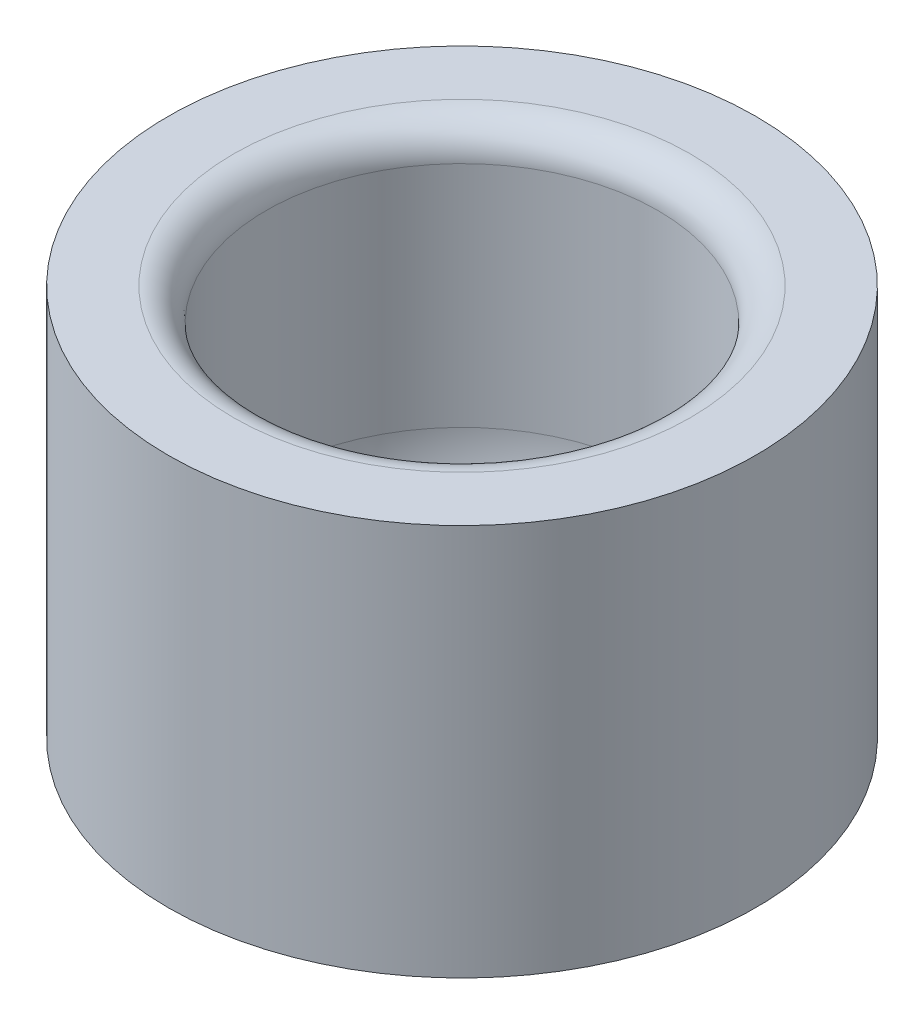
ISO-10303-21;
HEADER;
FILE_DESCRIPTION(('STEP AP214'),'2;1');
FILE_NAME('part.step','',(''),(''),'','','');
FILE_SCHEMA(('AUTOMOTIVE_DESIGN { 1 0 10303 214 1 1 1 1 }'));
ENDSEC;
DATA;
#1=APPLICATION_CONTEXT('core data for automotive mechanical design processes');
#2=APPLICATION_PROTOCOL_DEFINITION('international standard','automotive_design',2000,#1);
#3=PRODUCT_CONTEXT('',#1,'mechanical');
#4=PRODUCT('Part','Part','',(#3));
#5=PRODUCT_RELATED_PRODUCT_CATEGORY('part','',(#4));
#6=PRODUCT_DEFINITION_FORMATION('','',#4);
#7=PRODUCT_DEFINITION_CONTEXT('part definition',#1,'design');
#8=PRODUCT_DEFINITION('design','',#6,#7);
#9=PRODUCT_DEFINITION_SHAPE('','',#8);
#10=(LENGTH_UNIT() NAMED_UNIT(*) SI_UNIT(.MILLI.,.METRE.));
#11=(NAMED_UNIT(*) PLANE_ANGLE_UNIT() SI_UNIT($,.RADIAN.));
#12=(NAMED_UNIT(*) SI_UNIT($,.STERADIAN.) SOLID_ANGLE_UNIT());
#13=UNCERTAINTY_MEASURE_WITH_UNIT(LENGTH_MEASURE(1.E-05),#10,'distance_accuracy_value','');
#14=(GEOMETRIC_REPRESENTATION_CONTEXT(3) GLOBAL_UNCERTAINTY_ASSIGNED_CONTEXT((#13)) GLOBAL_UNIT_ASSIGNED_CONTEXT((#10,
#11,#12)) REPRESENTATION_CONTEXT('',''));
#15=CARTESIAN_POINT('',(0.,0.,0.));
#16=DIRECTION('',(0.,0.,1.));
#17=DIRECTION('',(1.,0.,0.));
#18=AXIS2_PLACEMENT_3D('',#15,#16,#17);
#19=CARTESIAN_POINT('',(0.,16.4,0.));
#20=DIRECTION('',(0.,-1.,0.));
#21=DIRECTION('',(0.,0.,-1.));
#22=AXIS2_PLACEMENT_3D('',#19,#20,#21);
#23=CYLINDRICAL_SURFACE('',#22,9.);
#24=CARTESIAN_POINT('',(0.,16.4,0.));
#25=DIRECTION('',(0.,1.,0.));
#26=DIRECTION('',(0.,0.,1.));
#27=AXIS2_PLACEMENT_3D('',#24,#25,#26);
#28=CIRCLE('',#27,9.);
#29=CARTESIAN_POINT('',(0.,16.4,9.));
#30=VERTEX_POINT('',#29);
#31=EDGE_CURVE('E52',#30,#30,#28,.T.);
#32=ORIENTED_EDGE('',*,*,#31,.F.);
#33=EDGE_LOOP('',(#32));
#34=FACE_BOUND('',#33,.T.);
#35=CARTESIAN_POINT('',(0.,4.3944374303262,0.));
#36=DIRECTION('',(0.,-1.,0.));
#37=DIRECTION('',(0.,0.,-1.));
#38=AXIS2_PLACEMENT_3D('',#35,#36,#37);
#39=CIRCLE('',#38,9.);
#40=CARTESIAN_POINT('',(0.,4.3944374303262,9.));
#41=VERTEX_POINT('',#40);
#42=EDGE_CURVE('E55',#41,#41,#39,.T.);
#43=ORIENTED_EDGE('',*,*,#42,.F.);
#44=EDGE_LOOP('',(#43));
#45=FACE_BOUND('',#44,.T.);
#46=ADVANCED_FACE('F32',(#34,#45),#23,.T.);
#47=CARTESIAN_POINT('',(0.,16.4,0.));
#48=DIRECTION('',(0.,1.,0.));
#49=DIRECTION('',(0.,0.,1.));
#50=AXIS2_PLACEMENT_3D('',#47,#48,#49);
#51=PLANE('',#50);
#52=CARTESIAN_POINT('',(0.,16.4,0.));
#53=DIRECTION('',(0.,1.,0.));
#54=DIRECTION('',(0.,0.,1.));
#55=AXIS2_PLACEMENT_3D('',#52,#53,#54);
#56=CIRCLE('',#55,7.);
#57=CARTESIAN_POINT('',(0.,16.4,7.));
#58=VERTEX_POINT('',#57);
#59=EDGE_CURVE('E10',#58,#58,#56,.F.);
#60=ORIENTED_EDGE('',*,*,#59,.T.);
#61=EDGE_LOOP('',(#60));
#62=FACE_BOUND('',#61,.T.);
#63=ORIENTED_EDGE('',*,*,#31,.T.);
#64=EDGE_LOOP('',(#63));
#65=FACE_BOUND('',#64,.T.);
#66=ADVANCED_FACE('F78',(#62,#65),#51,.T.);
#67=CARTESIAN_POINT('',(0.,3.40000000000001,0.));
#68=DIRECTION('',(0.,-1.,0.));
#69=DIRECTION('',(0.,0.,-1.));
#70=AXIS2_PLACEMENT_3D('',#67,#68,#69);
#71=PLANE('',#70);
#72=CARTESIAN_POINT('',(0.,3.40000000000001,0.));
#73=DIRECTION('',(0.,-1.,0.));
#74=DIRECTION('',(0.,0.,-1.));
#75=AXIS2_PLACEMENT_3D('',#72,#73,#74);
#76=CIRCLE('',#75,0.999999999999998);
#77=CARTESIAN_POINT('',(0.,3.40000000000001,-0.999999999999998));
#78=VERTEX_POINT('',#77);
#79=EDGE_CURVE('E47',#78,#78,#76,.F.);
#80=ORIENTED_EDGE('',*,*,#79,.T.);
#81=EDGE_LOOP('',(#80));
#82=FACE_BOUND('',#81,.T.);
#83=ADVANCED_FACE('F75',(#82),#71,.F.);
#84=CARTESIAN_POINT('',(0.,16.4,0.));
#85=DIRECTION('',(0.,1.,0.));
#86=DIRECTION('',(0.,0.,1.));
#87=AXIS2_PLACEMENT_3D('',#84,#85,#86);
#88=CYLINDRICAL_SURFACE('',#87,6.);
#89=CARTESIAN_POINT('',(0.,15.4,0.));
#90=DIRECTION('',(0.,1.,0.));
#91=DIRECTION('',(0.,0.,1.));
#92=AXIS2_PLACEMENT_3D('',#89,#90,#91);
#93=CIRCLE('',#92,6.);
#94=CARTESIAN_POINT('',(0.,15.4,6.));
#95=VERTEX_POINT('',#94);
#96=EDGE_CURVE('E39',#95,#95,#93,.T.);
#97=ORIENTED_EDGE('',*,*,#96,.T.);
#98=EDGE_LOOP('',(#97));
#99=FACE_BOUND('',#98,.T.);
#100=CARTESIAN_POINT('',(0.,8.40000000000001,0.));
#101=DIRECTION('',(0.,-1.,0.));
#102=DIRECTION('',(0.,0.,-1.));
#103=AXIS2_PLACEMENT_3D('',#100,#101,#102);
#104=CIRCLE('',#103,6.);
#105=CARTESIAN_POINT('',(0.,8.40000000000001,-6.));
#106=VERTEX_POINT('',#105);
#107=EDGE_CURVE('E43',#106,#106,#104,.T.);
#108=ORIENTED_EDGE('',*,*,#107,.T.);
#109=EDGE_LOOP('',(#108));
#110=FACE_BOUND('',#109,.T.);
#111=ADVANCED_FACE('F66',(#99,#110),#88,.F.);
#112=CARTESIAN_POINT('',(0.,0.,0.));
#113=DIRECTION('',(0.,1.,0.));
#114=DIRECTION('',(0.,0.,1.));
#115=AXIS2_PLACEMENT_3D('',#112,#113,#114);
#116=CONICAL_SURFACE('',#115,1.68642794823505,1.02974425867665);
#117=CARTESIAN_POINT('',(0.,0.,0.));
#118=DIRECTION('',(0.,-1.,0.));
#119=DIRECTION('',(0.,0.,-1.));
#120=AXIS2_PLACEMENT_3D('',#117,#118,#119);
#121=CIRCLE('',#120,1.68642794823505);
#122=CARTESIAN_POINT('',(0.,0.,1.68642794823505));
#123=VERTEX_POINT('',#122);
#124=EDGE_CURVE('E58',#123,#123,#121,.T.);
#125=CARTESIAN_POINT('',(0.,4.3944374303262,9.));
#126=CARTESIAN_POINT('',(0.,4.34866204042697,8.92381695779411));
#127=CARTESIAN_POINT('',(0.,4.30288665052773,8.84763391558823));
#128=CARTESIAN_POINT('',(0.,4.21133587072927,8.69526783117646));
#129=CARTESIAN_POINT('',(0.,4.16556048083004,8.61908478897058));
#130=CARTESIAN_POINT('',(0.,4.07400970103158,8.4667187045588));
#131=CARTESIAN_POINT('',(0.,4.02823431113235,8.39053566235292));
#132=CARTESIAN_POINT('',(0.,3.93668353133388,8.23816957794115));
#133=CARTESIAN_POINT('',(0.,3.89090814143465,8.16198653573526));
#134=CARTESIAN_POINT('',(0.,3.79935736163619,8.00962045132349));
#135=CARTESIAN_POINT('',(0.,3.75358197173696,7.93343740911761));
#136=CARTESIAN_POINT('',(0.,3.6620311919385,7.78107132470584));
#137=CARTESIAN_POINT('',(0.,3.61625580203927,7.70488828249996));
#138=CARTESIAN_POINT('',(0.,3.5247050222408,7.55252219808819));
#139=CARTESIAN_POINT('',(0.,3.47892963234157,7.4763391558823));
#140=CARTESIAN_POINT('',(0.,3.38737885254311,7.32397307147053));
#141=CARTESIAN_POINT('',(0.,3.34160346264388,7.24779002926465));
#142=CARTESIAN_POINT('',(0.,3.25005268284542,7.09542394485288));
#143=CARTESIAN_POINT('',(0.,3.20427729294619,7.01924090264699));
#144=CARTESIAN_POINT('',(0.,3.11272651314772,6.86687481823522));
#145=CARTESIAN_POINT('',(0.,3.06695112324849,6.79069177602934));
#146=CARTESIAN_POINT('',(0.,2.97540034345003,6.63832569161757));
#147=CARTESIAN_POINT('',(0.,2.9296249535508,6.56214264941168));
#148=CARTESIAN_POINT('',(0.,2.83807417375234,6.40977656499991));
#149=CARTESIAN_POINT('',(0.,2.79229878385311,6.33359352279403));
#150=CARTESIAN_POINT('',(0.,2.70074800405464,6.18122743838226));
#151=CARTESIAN_POINT('',(0.,2.65497261415541,6.10504439617637));
#152=CARTESIAN_POINT('',(0.,2.56342183435695,5.9526783117646));
#153=CARTESIAN_POINT('',(0.,2.51764644445772,5.87649526955872));
#154=CARTESIAN_POINT('',(0.,2.42609566465925,5.72412918514695));
#155=CARTESIAN_POINT('',(0.,2.38032027476002,5.64794614294106));
#156=CARTESIAN_POINT('',(0.,2.28876949496156,5.49558005852929));
#157=CARTESIAN_POINT('',(0.,2.24299410506233,5.41939701632341));
#158=CARTESIAN_POINT('',(0.,2.15144332526387,5.26703093191164));
#159=CARTESIAN_POINT('',(0.,2.10566793536464,5.19084788970576));
#160=CARTESIAN_POINT('',(0.,2.01411715556617,5.03848180529399));
#161=CARTESIAN_POINT('',(0.,1.96834176566694,4.9622987630881));
#162=CARTESIAN_POINT('',(0.,1.87679098586848,4.80993267867633));
#163=CARTESIAN_POINT('',(0.,1.83101559596925,4.73374963647045));
#164=CARTESIAN_POINT('',(0.,1.73946481617079,4.58138355205868));
#165=CARTESIAN_POINT('',(0.,1.69368942627156,4.50520050985279));
#166=CARTESIAN_POINT('',(0.,1.60213864647309,4.35283442544102));
#167=CARTESIAN_POINT('',(0.,1.55636325657386,4.27665138323514));
#168=CARTESIAN_POINT('',(0.,1.4648124767754,4.12428529882337));
#169=CARTESIAN_POINT('',(0.,1.41903708687617,4.04810225661748));
#170=CARTESIAN_POINT('',(0.,1.32748630707771,3.89573617220571));
#171=CARTESIAN_POINT('',(0.,1.28171091717847,3.81955312999983));
#172=CARTESIAN_POINT('',(0.,1.19016013738001,3.66718704558806));
#173=CARTESIAN_POINT('',(0.,1.14438474748078,3.59100400338217));
#174=CARTESIAN_POINT('',(0.,1.05283396768232,3.4386379189704));
#175=CARTESIAN_POINT('',(0.,1.00705857778309,3.36245487676452));
#176=CARTESIAN_POINT('',(0.,0.915507797984625,3.21008879235275));
#177=CARTESIAN_POINT('',(0.,0.869732408085393,3.13390575014686));
#178=CARTESIAN_POINT('',(0.,0.778181628286931,2.98153966573509));
#179=CARTESIAN_POINT('',(0.,0.7324062383877,2.90535662352921));
#180=CARTESIAN_POINT('',(0.,0.640855458589237,2.75299053911744));
#181=CARTESIAN_POINT('',(0.,0.595080068690006,2.67680749691155));
#182=CARTESIAN_POINT('',(0.,0.503529288891544,2.52444141249979));
#183=CARTESIAN_POINT('',(0.,0.457753898992313,2.4482583702939));
#184=CARTESIAN_POINT('',(0.,0.36620311919385,2.29589228588213));
#185=CARTESIAN_POINT('',(0.,0.320427729294618,2.21970924367624));
#186=CARTESIAN_POINT('',(0.,0.228876949496156,2.06734315926448));
#187=CARTESIAN_POINT('',(0.,0.183101559596925,1.99116011705859));
#188=CARTESIAN_POINT('',(0.,0.0915507797984623,1.83879403264682));
#189=CARTESIAN_POINT('',(0.,0.0457753898992312,1.76261099044094));
#190=CARTESIAN_POINT('',(0.,0.,1.68642794823505));
#191=B_SPLINE_CURVE_WITH_KNOTS('',3,(#125,#126,#127,#128,#129,#130,#131,#132,#133,#134,#135,
#136,#137,#138,#139,#140,#141,#142,#143,#144,#145,#146,#147,#148,#149,#150,#151,#152,#153,#154,
#155,#156,#157,#158,#159,#160,#161,#162,#163,#164,#165,#166,#167,#168,#169,#170,#171,#172,#173,
#174,#175,#176,#177,#178,#179,#180,#181,#182,#183,#184,#185,#186,#187,#188,#189,#190),
.UNSPECIFIED.,.F.,.F.,(4,2,2,2,2,2,2,2,2,2,2,2,2,2,2,2,2,2,2,2,2,2,2,2,2,2,2,2,2,2,2,2,4),(0.,
0.266633044016549,0.533266088033102,0.799899132049655,1.06653217606621,1.33316522008276,
1.59979826409931,1.86643130811586,2.13306435213241,2.39969739614897,2.66633044016552,
2.93296348418207,3.19959652819862,3.46622957221517,3.73286261623172,3.99949566024828,
4.26612870426483,4.53276174828138,4.79939479229793,5.06602783631448,5.33266088033104,
5.59929392434759,5.86592696836414,6.13256001238069,6.39919305639724,6.66582610041379,
6.93245914443035,7.1990921884469,7.46572523246345,7.73235827648,7.99899132049655,
8.26562436451311,8.53225740852966),.UNSPECIFIED.);
#192=EDGE_CURVE('BSEAM64',#41,#123,#191,.T.);
#193=ORIENTED_EDGE('',*,*,#42,.T.);
#194=ORIENTED_EDGE('',*,*,#124,.F.);
#195=ORIENTED_EDGE('',*,*,#192,.T.);
#196=ORIENTED_EDGE('',*,*,#192,.F.);
#197=EDGE_LOOP('',(#193,#195,#194,#196));
#198=FACE_BOUND('',#197,.T.);
#199=ADVANCED_FACE('F64',(#198),#116,.T.);
#200=CARTESIAN_POINT('',(0.,0.,0.));
#201=DIRECTION('',(0.,1.,0.));
#202=DIRECTION('',(0.,0.,1.));
#203=AXIS2_PLACEMENT_3D('',#200,#201,#202);
#204=PLANE('',#203);
#205=ORIENTED_EDGE('',*,*,#124,.T.);
#206=EDGE_LOOP('',(#205));
#207=FACE_BOUND('',#206,.T.);
#208=ADVANCED_FACE('F62',(#207),#204,.F.);
#209=CARTESIAN_POINT('',(0.,8.40000000000001,0.));
#210=DIRECTION('',(0.,-1.,0.));
#211=DIRECTION('',(0.,0.,-1.));
#212=AXIS2_PLACEMENT_3D('',#209,#210,#211);
#213=DEGENERATE_TOROIDAL_SURFACE('',#212,0.999999999999998,5.,.T.);
#214=ORIENTED_EDGE('',*,*,#107,.F.);
#215=EDGE_LOOP('',(#214));
#216=FACE_BOUND('',#215,.T.);
#217=ORIENTED_EDGE('',*,*,#79,.F.);
#218=EDGE_LOOP('',(#217));
#219=FACE_BOUND('',#218,.T.);
#220=ADVANCED_FACE('F73',(#216,#219),#213,.F.);
#221=CARTESIAN_POINT('',(0.,15.4,0.));
#222=DIRECTION('',(0.,1.,0.));
#223=DIRECTION('',(0.,0.,1.));
#224=AXIS2_PLACEMENT_3D('',#221,#222,#223);
#225=TOROIDAL_SURFACE('',#224,7.,1.);
#226=ORIENTED_EDGE('',*,*,#59,.F.);
#227=EDGE_LOOP('',(#226));
#228=FACE_BOUND('',#227,.T.);
#229=ORIENTED_EDGE('',*,*,#96,.F.);
#230=EDGE_LOOP('',(#229));
#231=FACE_BOUND('',#230,.T.);
#232=ADVANCED_FACE('F34',(#228,#231),#225,.T.);
#233=CLOSED_SHELL('',(#46,#66,#83,#111,#199,#208,#220,#232));
#234=MANIFOLD_SOLID_BREP('B2',#233);
#235=ADVANCED_BREP_SHAPE_REPRESENTATION('',(#18,#234),#14);
#236=SHAPE_DEFINITION_REPRESENTATION(#9,#235);
ENDSEC;
END-ISO-10303-21;
